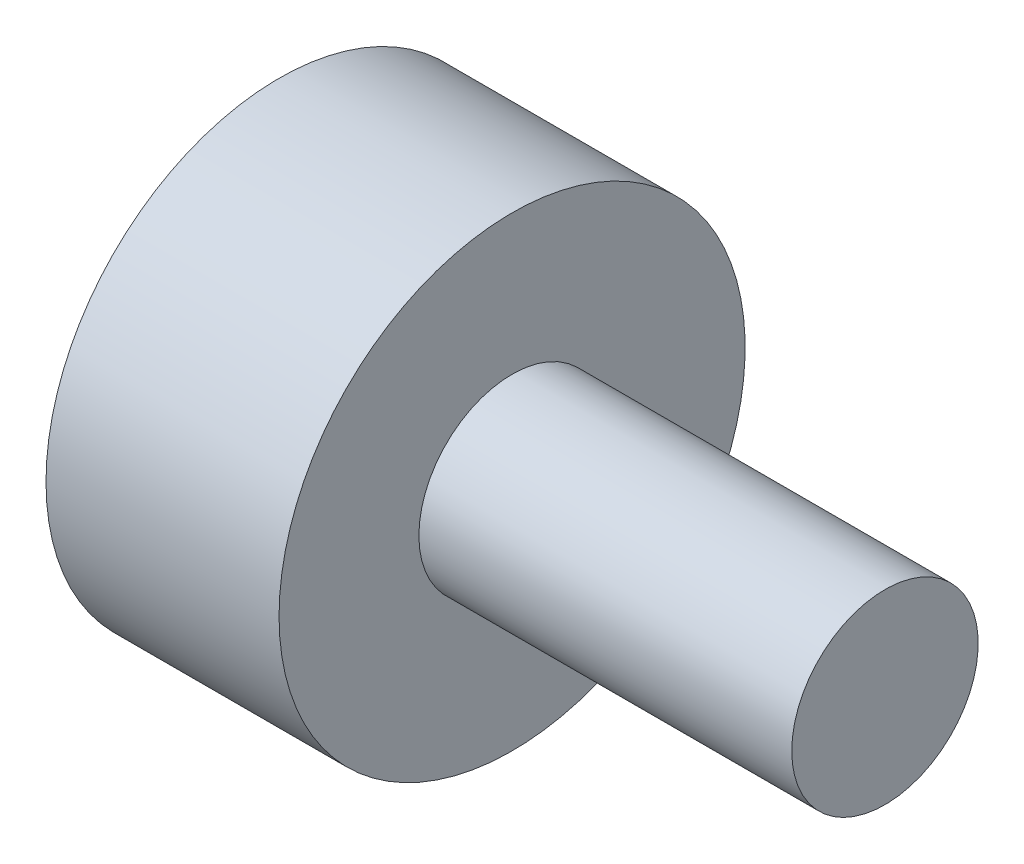
ISO-10303-21;
HEADER;
FILE_DESCRIPTION(('STEP AP214'),'2;1');
FILE_NAME('part.step','',(''),(''),'','','');
FILE_SCHEMA(('AUTOMOTIVE_DESIGN { 1 0 10303 214 1 1 1 1 }'));
ENDSEC;
DATA;
#1=APPLICATION_CONTEXT('core data for automotive mechanical design processes');
#2=APPLICATION_PROTOCOL_DEFINITION('international standard','automotive_design',2000,#1);
#3=PRODUCT_CONTEXT('',#1,'mechanical');
#4=PRODUCT('Part','Part','',(#3));
#5=PRODUCT_RELATED_PRODUCT_CATEGORY('part','',(#4));
#6=PRODUCT_DEFINITION_FORMATION('','',#4);
#7=PRODUCT_DEFINITION_CONTEXT('part definition',#1,'design');
#8=PRODUCT_DEFINITION('design','',#6,#7);
#9=PRODUCT_DEFINITION_SHAPE('','',#8);
#10=(LENGTH_UNIT() NAMED_UNIT(*) SI_UNIT(.MILLI.,.METRE.));
#11=(NAMED_UNIT(*) PLANE_ANGLE_UNIT() SI_UNIT($,.RADIAN.));
#12=(NAMED_UNIT(*) SI_UNIT($,.STERADIAN.) SOLID_ANGLE_UNIT());
#13=UNCERTAINTY_MEASURE_WITH_UNIT(LENGTH_MEASURE(1.E-05),#10,'distance_accuracy_value','');
#14=(GEOMETRIC_REPRESENTATION_CONTEXT(3) GLOBAL_UNCERTAINTY_ASSIGNED_CONTEXT((#13)) GLOBAL_UNIT_ASSIGNED_CONTEXT((#10,
#11,#12)) REPRESENTATION_CONTEXT('',''));
#15=CARTESIAN_POINT('',(0.,0.,0.));
#16=DIRECTION('',(0.,0.,1.));
#17=DIRECTION('',(1.,0.,0.));
#18=AXIS2_PLACEMENT_3D('',#15,#16,#17);
#19=CARTESIAN_POINT('',(0.,0.,0.));
#20=DIRECTION('',(-1.,0.,0.));
#21=DIRECTION('',(0.,0.,1.));
#22=AXIS2_PLACEMENT_3D('',#19,#20,#21);
#23=CYLINDRICAL_SURFACE('',#22,12.);
#24=CARTESIAN_POINT('',(12.,0.,0.));
#25=DIRECTION('',(-1.,0.,0.));
#26=DIRECTION('',(0.,0.,1.));
#27=AXIS2_PLACEMENT_3D('',#24,#25,#26);
#28=CIRCLE('',#27,12.);
#29=CARTESIAN_POINT('',(12.,0.,12.));
#30=VERTEX_POINT('',#29);
#31=EDGE_CURVE('E69',#30,#30,#28,.T.);
#32=ORIENTED_EDGE('',*,*,#31,.F.);
#33=EDGE_LOOP('',(#32));
#34=FACE_BOUND('',#33,.T.);
#35=CARTESIAN_POINT('',(0.,0.,0.));
#36=DIRECTION('',(-1.,0.,0.));
#37=DIRECTION('',(0.,0.,1.));
#38=AXIS2_PLACEMENT_3D('',#35,#36,#37);
#39=CIRCLE('',#38,12.);
#40=CARTESIAN_POINT('',(0.,0.,12.));
#41=VERTEX_POINT('',#40);
#42=EDGE_CURVE('E10',#41,#41,#39,.T.);
#43=ORIENTED_EDGE('',*,*,#42,.T.);
#44=EDGE_LOOP('',(#43));
#45=FACE_BOUND('',#44,.T.);
#46=ADVANCED_FACE('F41',(#34,#45),#23,.F.);
#47=CARTESIAN_POINT('',(0.,12.,0.));
#48=DIRECTION('',(1.,0.,0.));
#49=DIRECTION('',(0.,0.,-1.));
#50=AXIS2_PLACEMENT_3D('',#47,#48,#49);
#51=PLANE('',#50);
#52=ORIENTED_EDGE('',*,*,#42,.F.);
#53=EDGE_LOOP('',(#52));
#54=FACE_BOUND('',#53,.T.);
#55=CARTESIAN_POINT('',(0.,0.,0.));
#56=DIRECTION('',(-1.,0.,0.));
#57=DIRECTION('',(0.,0.,1.));
#58=AXIS2_PLACEMENT_3D('',#55,#56,#57);
#59=CIRCLE('',#58,25.);
#60=CARTESIAN_POINT('',(0.,0.,25.));
#61=VERTEX_POINT('',#60);
#62=EDGE_CURVE('E50',#61,#61,#59,.T.);
#63=ORIENTED_EDGE('',*,*,#62,.T.);
#64=EDGE_LOOP('',(#63));
#65=FACE_BOUND('',#64,.T.);
#66=ADVANCED_FACE('F78',(#54,#65),#51,.F.);
#67=CARTESIAN_POINT('',(0.,0.,0.));
#68=DIRECTION('',(-1.,0.,0.));
#69=DIRECTION('',(0.,0.,1.));
#70=AXIS2_PLACEMENT_3D('',#67,#68,#69);
#71=CYLINDRICAL_SURFACE('',#70,25.);
#72=ORIENTED_EDGE('',*,*,#62,.F.);
#73=EDGE_LOOP('',(#72));
#74=FACE_BOUND('',#73,.T.);
#75=CARTESIAN_POINT('',(25.,0.,0.));
#76=DIRECTION('',(-1.,0.,0.));
#77=DIRECTION('',(0.,0.,1.));
#78=AXIS2_PLACEMENT_3D('',#75,#76,#77);
#79=CIRCLE('',#78,25.);
#80=CARTESIAN_POINT('',(25.,0.,25.));
#81=VERTEX_POINT('',#80);
#82=EDGE_CURVE('E51',#81,#81,#79,.T.);
#83=ORIENTED_EDGE('',*,*,#82,.T.);
#84=EDGE_LOOP('',(#83));
#85=FACE_BOUND('',#84,.T.);
#86=ADVANCED_FACE('F79',(#74,#85),#71,.T.);
#87=CARTESIAN_POINT('',(25.,25.,0.));
#88=DIRECTION('',(-1.,0.,0.));
#89=DIRECTION('',(0.,0.,1.));
#90=AXIS2_PLACEMENT_3D('',#87,#88,#89);
#91=PLANE('',#90);
#92=ORIENTED_EDGE('',*,*,#82,.F.);
#93=EDGE_LOOP('',(#92));
#94=FACE_BOUND('',#93,.T.);
#95=CARTESIAN_POINT('',(25.,0.,0.));
#96=DIRECTION('',(-1.,0.,0.));
#97=DIRECTION('',(0.,0.,1.));
#98=AXIS2_PLACEMENT_3D('',#95,#96,#97);
#99=CIRCLE('',#98,10.);
#100=CARTESIAN_POINT('',(25.,0.,10.));
#101=VERTEX_POINT('',#100);
#102=EDGE_CURVE('E54',#101,#101,#99,.T.);
#103=ORIENTED_EDGE('',*,*,#102,.T.);
#104=EDGE_LOOP('',(#103));
#105=FACE_BOUND('',#104,.T.);
#106=ADVANCED_FACE('F82',(#94,#105),#91,.F.);
#107=CARTESIAN_POINT('',(0.,0.,0.));
#108=DIRECTION('',(-1.,0.,0.));
#109=DIRECTION('',(0.,0.,1.));
#110=AXIS2_PLACEMENT_3D('',#107,#108,#109);
#111=CYLINDRICAL_SURFACE('',#110,10.);
#112=ORIENTED_EDGE('',*,*,#102,.F.);
#113=EDGE_LOOP('',(#112));
#114=FACE_BOUND('',#113,.T.);
#115=CARTESIAN_POINT('',(65.,0.,0.));
#116=DIRECTION('',(-1.,0.,0.));
#117=DIRECTION('',(0.,0.,1.));
#118=AXIS2_PLACEMENT_3D('',#115,#116,#117);
#119=CIRCLE('',#118,10.);
#120=CARTESIAN_POINT('',(65.,0.,10.));
#121=VERTEX_POINT('',#120);
#122=EDGE_CURVE('E58',#121,#121,#119,.T.);
#123=ORIENTED_EDGE('',*,*,#122,.T.);
#124=EDGE_LOOP('',(#123));
#125=FACE_BOUND('',#124,.T.);
#126=ADVANCED_FACE('F91',(#114,#125),#111,.T.);
#127=CARTESIAN_POINT('',(65.,10.,0.));
#128=DIRECTION('',(-1.,0.,0.));
#129=DIRECTION('',(0.,0.,1.));
#130=AXIS2_PLACEMENT_3D('',#127,#128,#129);
#131=PLANE('',#130);
#132=ORIENTED_EDGE('',*,*,#122,.F.);
#133=EDGE_LOOP('',(#132));
#134=FACE_BOUND('',#133,.T.);
#135=ADVANCED_FACE('F94',(#134),#131,.F.);
#136=CARTESIAN_POINT('',(40.,0.,0.));
#137=DIRECTION('',(1.,0.,0.));
#138=DIRECTION('',(0.,0.,-1.));
#139=AXIS2_PLACEMENT_3D('',#136,#137,#138);
#140=PLANE('',#139);
#141=CARTESIAN_POINT('',(40.,0.,0.));
#142=DIRECTION('',(-1.,0.,0.));
#143=DIRECTION('',(0.,0.,1.));
#144=AXIS2_PLACEMENT_3D('',#141,#142,#143);
#145=CIRCLE('',#144,7.);
#146=CARTESIAN_POINT('',(40.,0.,7.));
#147=VERTEX_POINT('',#146);
#148=EDGE_CURVE('E64',#147,#147,#145,.T.);
#149=ORIENTED_EDGE('',*,*,#148,.T.);
#150=EDGE_LOOP('',(#149));
#151=FACE_BOUND('',#150,.T.);
#152=ADVANCED_FACE('F98',(#151),#140,.F.);
#153=CARTESIAN_POINT('',(0.,0.,0.));
#154=DIRECTION('',(-1.,0.,0.));
#155=DIRECTION('',(0.,0.,1.));
#156=AXIS2_PLACEMENT_3D('',#153,#154,#155);
#157=CYLINDRICAL_SURFACE('',#156,7.);
#158=ORIENTED_EDGE('',*,*,#148,.F.);
#159=EDGE_LOOP('',(#158));
#160=FACE_BOUND('',#159,.T.);
#161=CARTESIAN_POINT('',(12.,0.,0.));
#162=DIRECTION('',(-1.,0.,0.));
#163=DIRECTION('',(0.,0.,1.));
#164=AXIS2_PLACEMENT_3D('',#161,#162,#163);
#165=CIRCLE('',#164,7.);
#166=CARTESIAN_POINT('',(12.,0.,7.));
#167=VERTEX_POINT('',#166);
#168=EDGE_CURVE('E67',#167,#167,#165,.T.);
#169=ORIENTED_EDGE('',*,*,#168,.T.);
#170=EDGE_LOOP('',(#169));
#171=FACE_BOUND('',#170,.T.);
#172=ADVANCED_FACE('F104',(#160,#171),#157,.F.);
#173=CARTESIAN_POINT('',(12.,7.,0.));
#174=DIRECTION('',(1.,0.,0.));
#175=DIRECTION('',(0.,0.,-1.));
#176=AXIS2_PLACEMENT_3D('',#173,#174,#175);
#177=PLANE('',#176);
#178=ORIENTED_EDGE('',*,*,#168,.F.);
#179=EDGE_LOOP('',(#178));
#180=FACE_BOUND('',#179,.T.);
#181=ORIENTED_EDGE('',*,*,#31,.T.);
#182=EDGE_LOOP('',(#181));
#183=FACE_BOUND('',#182,.T.);
#184=ADVANCED_FACE('F74',(#180,#183),#177,.F.);
#185=CLOSED_SHELL('',(#46,#66,#86,#106,#126,#135,#152,#172,#184));
#186=MANIFOLD_SOLID_BREP('B2',#185);
#187=ADVANCED_BREP_SHAPE_REPRESENTATION('',(#18,#186),#14);
#188=SHAPE_DEFINITION_REPRESENTATION(#9,#187);
ENDSEC;
END-ISO-10303-21;
